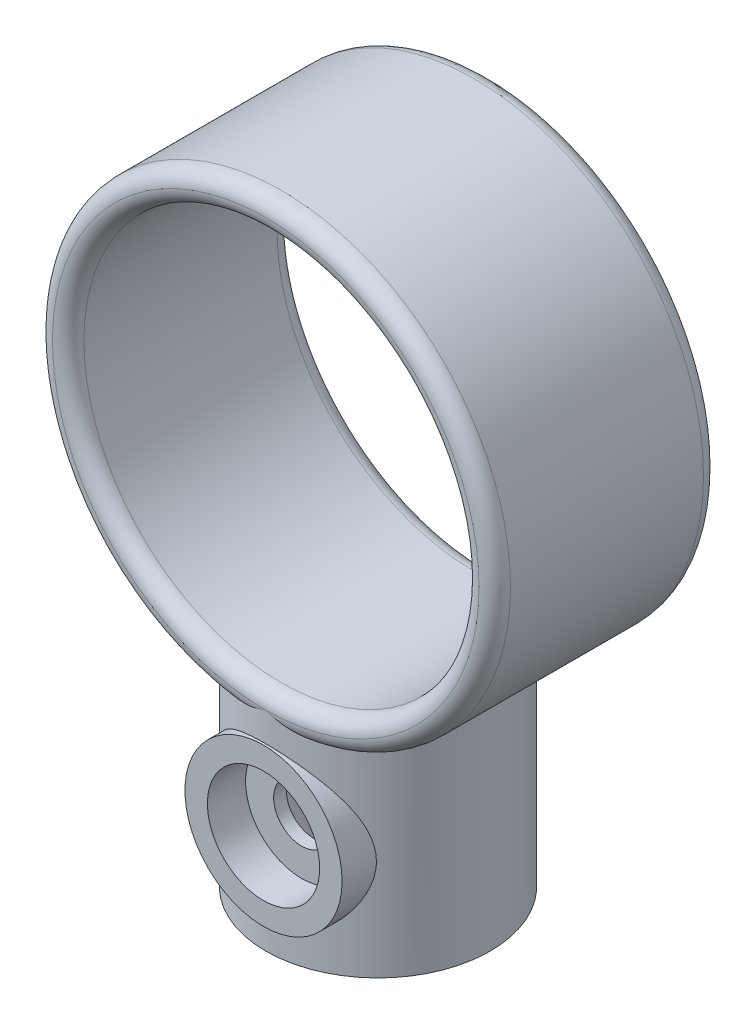
ISO-10303-21;
HEADER;
FILE_DESCRIPTION(('STEP AP214'),'2;1');
FILE_NAME('part.step','',(''),(''),'','','');
FILE_SCHEMA(('AUTOMOTIVE_DESIGN { 1 0 10303 214 1 1 1 1 }'));
ENDSEC;
DATA;
#1=APPLICATION_CONTEXT('core data for automotive mechanical design processes');
#2=APPLICATION_PROTOCOL_DEFINITION('international standard','automotive_design',2000,#1);
#3=PRODUCT_CONTEXT('',#1,'mechanical');
#4=PRODUCT('Part','Part','',(#3));
#5=PRODUCT_RELATED_PRODUCT_CATEGORY('part','',(#4));
#6=PRODUCT_DEFINITION_FORMATION('','',#4);
#7=PRODUCT_DEFINITION_CONTEXT('part definition',#1,'design');
#8=PRODUCT_DEFINITION('design','',#6,#7);
#9=PRODUCT_DEFINITION_SHAPE('','',#8);
#10=(LENGTH_UNIT() NAMED_UNIT(*) SI_UNIT(.MILLI.,.METRE.));
#11=(NAMED_UNIT(*) PLANE_ANGLE_UNIT() SI_UNIT($,.RADIAN.));
#12=(NAMED_UNIT(*) SI_UNIT($,.STERADIAN.) SOLID_ANGLE_UNIT());
#13=UNCERTAINTY_MEASURE_WITH_UNIT(LENGTH_MEASURE(1.E-05),#10,'distance_accuracy_value','');
#14=(GEOMETRIC_REPRESENTATION_CONTEXT(3) GLOBAL_UNCERTAINTY_ASSIGNED_CONTEXT((#13)) GLOBAL_UNIT_ASSIGNED_CONTEXT((#10,
#11,#12)) REPRESENTATION_CONTEXT('',''));
#15=CARTESIAN_POINT('',(0.,0.,0.));
#16=DIRECTION('',(0.,0.,1.));
#17=DIRECTION('',(1.,0.,0.));
#18=AXIS2_PLACEMENT_3D('',#15,#16,#17);
#19=CARTESIAN_POINT('',(-1.5875,-13.081,3.60275071993609));
#20=DIRECTION('',(0.,0.,-1.));
#21=DIRECTION('',(-1.,0.,0.));
#22=AXIS2_PLACEMENT_3D('',#19,#20,#21);
#23=PLANE('',#22);
#24=CARTESIAN_POINT('',(0.,-18.161,3.60275071993609));
#25=DIRECTION('',(0.,0.,-1.));
#26=DIRECTION('',(-1.,0.,0.));
#27=AXIS2_PLACEMENT_3D('',#24,#25,#26);
#28=CIRCLE('',#27,1.5875);
#29=CARTESIAN_POINT('',(1.5875,-18.161,3.60275071993609));
#30=VERTEX_POINT('',#29);
#31=CARTESIAN_POINT('',(-1.5875,-18.161,3.60275071993609));
#32=VERTEX_POINT('',#31);
#33=EDGE_CURVE('E48',#30,#32,#28,.F.);
#34=ORIENTED_EDGE('',*,*,#33,.T.);
#35=DIRECTION('',(0.,-1.,0.));
#36=VECTOR('',#35,1.);
#37=CARTESIAN_POINT('',(-1.5875,-13.081,3.60275071993609));
#38=LINE('',#37,#36);
#39=CARTESIAN_POINT('',(-1.5875,-13.081,3.60275071993609));
#40=VERTEX_POINT('',#39);
#41=EDGE_CURVE('E94',#40,#32,#38,.T.);
#42=ORIENTED_EDGE('',*,*,#41,.F.);
#43=DIRECTION('',(1.,0.,0.));
#44=VECTOR('',#43,1.);
#45=CARTESIAN_POINT('',(-1.5875,-13.081,3.60275071993609));
#46=LINE('',#45,#44);
#47=CARTESIAN_POINT('',(1.5875,-13.081,3.60275071993609));
#48=VERTEX_POINT('',#47);
#49=EDGE_CURVE('E316',#40,#48,#46,.T.);
#50=ORIENTED_EDGE('',*,*,#49,.T.);
#51=DIRECTION('',(0.,-1.,0.));
#52=VECTOR('',#51,1.);
#53=CARTESIAN_POINT('',(1.5875,-13.081,3.60275071993609));
#54=LINE('',#53,#52);
#55=EDGE_CURVE('E97',#48,#30,#54,.T.);
#56=ORIENTED_EDGE('',*,*,#55,.T.);
#57=EDGE_LOOP('',(#34,#42,#50,#56));
#58=FACE_BOUND('',#57,.T.);
#59=ADVANCED_FACE('F32',(#58),#23,.T.);
#60=CARTESIAN_POINT('',(0.,0.,6.35));
#61=DIRECTION('',(0.,0.,-1.));
#62=DIRECTION('',(-1.,0.,0.));
#63=AXIS2_PLACEMENT_3D('',#60,#61,#62);
#64=CYLINDRICAL_SURFACE('',#63,12.954);
#65=CARTESIAN_POINT('',(3.24036710883196,-12.5421743330254,5.461));
#66=CARTESIAN_POINT('',(3.39852522462521,-12.5013289140052,5.3671597632469));
#67=CARTESIAN_POINT('',(3.55217752044027,-12.4584249616043,5.26669390443529));
#68=CARTESIAN_POINT('',(3.84965096987879,-12.3697324218358,5.05333201669568));
#69=CARTESIAN_POINT('',(3.99347466921348,-12.3239445873738,4.94043922640486));
#70=CARTESIAN_POINT('',(4.27083010876806,-12.2306014429006,4.70275872357515));
#71=CARTESIAN_POINT('',(4.40434080334163,-12.1830427976537,4.57794779237893));
#72=CARTESIAN_POINT('',(4.66006458045994,-12.0875364916295,4.31736305313483));
#73=CARTESIAN_POINT('',(4.78227686063104,-12.0395888034862,4.18158846776758));
#74=CARTESIAN_POINT('',(5.01469040120089,-11.944653866851,3.89983668322423));
#75=CARTESIAN_POINT('',(5.12489323990881,-11.8976664928134,3.75386082887165));
#76=CARTESIAN_POINT('',(5.33259764482756,-11.8060325517916,3.45244782369329));
#77=CARTESIAN_POINT('',(5.43009998126519,-11.7613858429551,3.29701124745623));
#78=CARTESIAN_POINT('',(5.61163527866141,-11.6758611465619,2.97754710010607));
#79=CARTESIAN_POINT('',(5.69567354314322,-11.634981677791,2.81352294560311));
#80=CARTESIAN_POINT('',(5.84950609563158,-11.5584072748217,2.47786884938217));
#81=CARTESIAN_POINT('',(5.91930894548802,-11.5227092280187,2.30624355540943));
#82=CARTESIAN_POINT('',(6.04225375411199,-11.4587068535101,1.96119636338971));
#83=CARTESIAN_POINT('',(6.09579731886463,-11.4302277966821,1.78795037114736));
#84=CARTESIAN_POINT('',(6.18802378047826,-11.3805635795997,1.43660218929917));
#85=CARTESIAN_POINT('',(6.22671417876988,-11.3593747380637,1.2585024998054));
#86=CARTESIAN_POINT('',(6.28868651624801,-11.3251840946852,0.89898341229282));
#87=CARTESIAN_POINT('',(6.31197893575739,-11.3121767245828,0.717566358775573));
#88=CARTESIAN_POINT('',(6.3428187521879,-11.2949141873091,0.352992130970151));
#89=CARTESIAN_POINT('',(6.3503680944522,-11.2906579387786,0.169835174488652));
#90=CARTESIAN_POINT('',(6.34965030434776,-11.2910603396301,-0.174261173455878));
#91=CARTESIAN_POINT('',(6.34318530331367,-11.2947032402249,-0.335209077085667));
#92=CARTESIAN_POINT('',(6.31808188918243,-11.3087650134274,-0.655908010113539));
#93=CARTESIAN_POINT('',(6.29943960912104,-11.3191860384627,-0.815658643006467));
#94=CARTESIAN_POINT('',(6.25021818599324,-11.3464388862601,-1.13269687533649));
#95=CARTESIAN_POINT('',(6.21964262857683,-11.3632687832804,-1.28998519988325));
#96=CARTESIAN_POINT('',(6.14689582918937,-11.4027846862798,-1.60116103993987));
#97=CARTESIAN_POINT('',(6.10472002952448,-11.4254729937927,-1.75504719302076));
#98=CARTESIAN_POINT('',(6.00975901220213,-11.475703003346,-2.05669794505564));
#99=CARTESIAN_POINT('',(5.95710152067306,-11.5031858257983,-2.20451262164992));
#100=CARTESIAN_POINT('',(5.84134309078098,-11.5623982498814,-2.49513680883964));
#101=CARTESIAN_POINT('',(5.77823846456497,-11.5941293504009,-2.63794453032428));
#102=CARTESIAN_POINT('',(5.57389486119005,-11.694479243674,-3.05794933233523));
#103=CARTESIAN_POINT('',(5.41761476852702,-11.7682609248339,-3.32676388477283));
#104=CARTESIAN_POINT('',(5.04847190678808,-11.9316543254777,-3.86714840118444));
#105=CARTESIAN_POINT('',(4.83113561669506,-12.0221086764829,-4.1353828885951));
#106=CARTESIAN_POINT('',(4.35599693398777,-12.2022811043992,-4.63311734663731));
#107=CARTESIAN_POINT('',(4.09825242627773,-12.2920000442499,-4.8626717653671));
#108=CARTESIAN_POINT('',(3.72972717262803,-12.405838917192,-5.14055569070788));
#109=CARTESIAN_POINT('',(3.63446711338259,-12.4341060951539,-5.20834633101998));
#110=CARTESIAN_POINT('',(3.44020812182985,-12.4892450919535,-5.33864235829698));
#111=CARTESIAN_POINT('',(3.34121442075257,-12.5161187463556,-5.40115476975097));
#112=CARTESIAN_POINT('',(3.24036710883196,-12.5421743330254,-5.461));
#113=B_SPLINE_CURVE_WITH_KNOTS('',3,(#65,#66,#67,#68,#69,#70,#71,#72,#73,#74,#75,#76,#77,#78,
#79,#80,#81,#82,#83,#84,#85,#86,#87,#88,#89,#90,#91,#92,#93,#94,#95,#96,#97,#98,#99,#100,#101,
#102,#103,#104,#105,#106,#107,#108,#109,#110,#111,#112),.UNSPECIFIED.,.F.,.F.,(4,2,2,2,2,2,2,2,
2,2,2,2,2,2,2,2,2,2,2,2,2,2,2,4),(0.,0.564918574417948,1.12969026993981,1.69558560596926,
2.26152109907353,2.82738212567331,3.39320881942291,3.95881208207186,4.52407415441085,
5.07395790418037,5.623563574629,6.17279478088915,6.72195811563468,7.20471712883733,
7.68762951948826,8.17039691867365,8.65335426707066,9.13075176408271,9.60831814381731,
10.5633377143873,11.6297455977876,12.6946395764977,13.0553653523496,13.4156032331266),.UNSPECIFIED.);
#114=CARTESIAN_POINT('',(3.24036710883196,-12.5421743330254,5.461));
#115=VERTEX_POINT('',#114);
#116=CARTESIAN_POINT('',(3.24036710885588,-12.5421743330192,-5.461));
#117=VERTEX_POINT('',#116);
#118=EDGE_CURVE('E185',#115,#117,#113,.T.);
#119=ORIENTED_EDGE('',*,*,#118,.T.);
#120=CARTESIAN_POINT('',(0.,0.,-5.461));
#121=DIRECTION('',(0.,0.,1.));
#122=DIRECTION('',(1.,0.,0.));
#123=AXIS2_PLACEMENT_3D('',#120,#121,#122);
#124=CIRCLE('',#123,12.954);
#125=CARTESIAN_POINT('',(-3.24036710883196,-12.5421743330254,-5.461));
#126=VERTEX_POINT('',#125);
#127=EDGE_CURVE('E205',#117,#126,#124,.T.);
#128=ORIENTED_EDGE('',*,*,#127,.T.);
#129=CARTESIAN_POINT('',(-3.24036710883196,-12.5421743330254,-5.461));
#130=CARTESIAN_POINT('',(-3.39852522462521,-12.5013289140052,-5.3671597632469));
#131=CARTESIAN_POINT('',(-3.55217752044027,-12.4584249616043,-5.26669390443529));
#132=CARTESIAN_POINT('',(-3.84965096987879,-12.3697324218358,-5.05333201669568));
#133=CARTESIAN_POINT('',(-3.99347466921348,-12.3239445873738,-4.94043922640486));
#134=CARTESIAN_POINT('',(-4.27083010876806,-12.2306014429006,-4.70275872357515));
#135=CARTESIAN_POINT('',(-4.40434080334163,-12.1830427976537,-4.57794779237893));
#136=CARTESIAN_POINT('',(-4.66006458045994,-12.0875364916295,-4.31736305313482));
#137=CARTESIAN_POINT('',(-4.78227686063104,-12.0395888034862,-4.18158846776758));
#138=CARTESIAN_POINT('',(-5.01469040120089,-11.944653866851,-3.89983668322423));
#139=CARTESIAN_POINT('',(-5.12489323990881,-11.8976664928134,-3.75386082887165));
#140=CARTESIAN_POINT('',(-5.33259764482756,-11.8060325517916,-3.45244782369329));
#141=CARTESIAN_POINT('',(-5.43009998126519,-11.7613858429551,-3.29701124745623));
#142=CARTESIAN_POINT('',(-5.61163527866141,-11.6758611465619,-2.97754710010607));
#143=CARTESIAN_POINT('',(-5.69567354314322,-11.634981677791,-2.81352294560311));
#144=CARTESIAN_POINT('',(-5.84950609563158,-11.5584072748217,-2.47786884938217));
#145=CARTESIAN_POINT('',(-5.91930894548802,-11.5227092280187,-2.30624355540943));
#146=CARTESIAN_POINT('',(-6.04225375411199,-11.4587068535101,-1.96119636338971));
#147=CARTESIAN_POINT('',(-6.09579731886463,-11.4302277966821,-1.78795037114737));
#148=CARTESIAN_POINT('',(-6.18802378047826,-11.3805635795997,-1.43660218929917));
#149=CARTESIAN_POINT('',(-6.22671417876988,-11.3593747380637,-1.2585024998054));
#150=CARTESIAN_POINT('',(-6.28868651624801,-11.3251840946852,-0.898983412292822));
#151=CARTESIAN_POINT('',(-6.31197893575739,-11.3121767245828,-0.717566358775575));
#152=CARTESIAN_POINT('',(-6.3428187521879,-11.2949141873091,-0.352992130970153));
#153=CARTESIAN_POINT('',(-6.3503680944522,-11.2906579387786,-0.169835174488654));
#154=CARTESIAN_POINT('',(-6.34965030434776,-11.2910603396301,0.174261173455877));
#155=CARTESIAN_POINT('',(-6.34318530331367,-11.2947032402249,0.335209077085665));
#156=CARTESIAN_POINT('',(-6.31808188918243,-11.3087650134274,0.655908010113539));
#157=CARTESIAN_POINT('',(-6.29943960912104,-11.3191860384627,0.815658643006467));
#158=CARTESIAN_POINT('',(-6.25021818599324,-11.3464388862601,1.13269687533649));
#159=CARTESIAN_POINT('',(-6.21964262857683,-11.3632687832804,1.28998519988325));
#160=CARTESIAN_POINT('',(-6.14689582918937,-11.4027846862798,1.60116103993987));
#161=CARTESIAN_POINT('',(-6.10472002952448,-11.4254729937927,1.75504719302076));
#162=CARTESIAN_POINT('',(-6.00975901220213,-11.475703003346,2.05669794505564));
#163=CARTESIAN_POINT('',(-5.95710152067307,-11.5031858257983,2.20451262164992));
#164=CARTESIAN_POINT('',(-5.84134309078098,-11.5623982498814,2.49513680883964));
#165=CARTESIAN_POINT('',(-5.77823846456497,-11.5941293504009,2.63794453032428));
#166=CARTESIAN_POINT('',(-5.57389486119005,-11.694479243674,3.05794933233523));
#167=CARTESIAN_POINT('',(-5.41761476852702,-11.7682609248339,3.32676388477283));
#168=CARTESIAN_POINT('',(-5.04847190678807,-11.9316543254777,3.86714840118444));
#169=CARTESIAN_POINT('',(-4.83113561669506,-12.0221086764829,4.1353828885951));
#170=CARTESIAN_POINT('',(-4.35599693398777,-12.2022811043992,4.63311734663731));
#171=CARTESIAN_POINT('',(-4.09825242627773,-12.2920000442499,4.8626717653671));
#172=CARTESIAN_POINT('',(-3.72972717262803,-12.405838917192,5.14055569070787));
#173=CARTESIAN_POINT('',(-3.63446711338259,-12.4341060951539,5.20834633101998));
#174=CARTESIAN_POINT('',(-3.44020812182985,-12.4892450919535,5.33864235829698));
#175=CARTESIAN_POINT('',(-3.34121442075257,-12.5161187463556,5.40115476975097));
#176=CARTESIAN_POINT('',(-3.24036710883196,-12.5421743330254,5.461));
#177=B_SPLINE_CURVE_WITH_KNOTS('',3,(#129,#130,#131,#132,#133,#134,#135,#136,#137,#138,#139,
#140,#141,#142,#143,#144,#145,#146,#147,#148,#149,#150,#151,#152,#153,#154,#155,#156,#157,#158,
#159,#160,#161,#162,#163,#164,#165,#166,#167,#168,#169,#170,#171,#172,#173,#174,#175,#176),
.UNSPECIFIED.,.F.,.F.,(4,2,2,2,2,2,2,2,2,2,2,2,2,2,2,2,2,2,2,2,2,2,2,4),(0.,0.564918574417947,
1.12969026993981,1.69558560596926,2.26152109907353,2.8273821256733,3.39320881942291,
3.95881208207186,4.52407415441085,5.07395790418037,5.623563574629,6.17279478088914,
6.72195811563468,7.20471712883733,7.68762951948826,8.17039691867365,8.65335426707066,
9.13075176408271,9.60831814381731,10.5633377143873,11.6297455977876,12.6946395764977,
13.0553653523496,13.4156032331266),.UNSPECIFIED.);
#178=CARTESIAN_POINT('',(-3.24036710885588,-12.5421743330192,5.461));
#179=VERTEX_POINT('',#178);
#180=EDGE_CURVE('E180',#126,#179,#177,.T.);
#181=ORIENTED_EDGE('',*,*,#180,.T.);
#182=CARTESIAN_POINT('',(0.,0.,5.461));
#183=DIRECTION('',(0.,0.,1.));
#184=DIRECTION('',(1.,0.,0.));
#185=AXIS2_PLACEMENT_3D('',#182,#183,#184);
#186=CIRCLE('',#185,12.954);
#187=EDGE_CURVE('E207',#179,#115,#186,.F.);
#188=ORIENTED_EDGE('',*,*,#187,.T.);
#189=EDGE_LOOP('',(#119,#128,#181,#188));
#190=FACE_BOUND('',#189,.T.);
#191=ADVANCED_FACE('F140',(#190),#64,.T.);
#192=CARTESIAN_POINT('',(0.,0.,5.461));
#193=DIRECTION('',(0.,0.,1.));
#194=DIRECTION('',(1.,0.,0.));
#195=AXIS2_PLACEMENT_3D('',#192,#193,#194);
#196=TOROIDAL_SURFACE('',#195,12.065,0.889);
#197=ORIENTED_EDGE('',*,*,#187,.F.);
#198=CARTESIAN_POINT('',(0.,-12.065,6.35));
#199=CARTESIAN_POINT('',(-0.0049753566682711,-12.0668615962767,6.35000001416907));
#200=CARTESIAN_POINT('',(-0.00995194868503857,-12.0687205892014,6.34999416625));
#201=CARTESIAN_POINT('',(-0.296728366632753,-12.1756671678125,6.34931912284531));
#202=CARTESIAN_POINT('',(-0.582434011994521,-12.2723149102974,6.32984568349606));
#203=CARTESIAN_POINT('',(-1.01283058365574,-12.3963076915538,6.27038770900221));
#204=CARTESIAN_POINT('',(-1.15680061958639,-12.4341795165179,6.24547220860568));
#205=CARTESIAN_POINT('',(-1.44453512868541,-12.501251855032,6.18525795196299));
#206=CARTESIAN_POINT('',(-1.58829967387304,-12.5304577027702,6.14996560974658));
#207=CARTESIAN_POINT('',(-1.92510179420407,-12.5867279925364,6.05448732027586));
#208=CARTESIAN_POINT('',(-2.11771865694031,-12.6094410289226,5.98991176140608));
#209=CARTESIAN_POINT('',(-2.40170474368737,-12.6245893779713,5.8791706195158));
#210=CARTESIAN_POINT('',(-2.49539153035808,-12.6264977749512,5.84002066910208));
#211=CARTESIAN_POINT('',(-2.68065923043765,-12.6231756589345,5.75732810358994));
#212=CARTESIAN_POINT('',(-2.77224144974642,-12.6179497015369,5.71378830803747));
#213=CARTESIAN_POINT('',(-2.92708562851502,-12.6020217133466,5.63559423431918));
#214=CARTESIAN_POINT('',(-2.99103977062668,-12.5932835420391,5.60190418118179));
#215=CARTESIAN_POINT('',(-3.1172522850251,-12.5712265256637,5.5326711697423));
#216=CARTESIAN_POINT('',(-3.17950796254431,-12.5579008118376,5.49712550118955));
#217=CARTESIAN_POINT('',(-3.24070414570661,-12.5420872288923,5.4608));
#218=B_SPLINE_CURVE_WITH_KNOTS('',3,(#198,#199,#200,#201,#202,#203,#204,#205,#206,#207,#208,
#209,#210,#211,#212,#213,#214,#215,#216,#217),.UNSPECIFIED.,.F.,.F.,(4,2,2,2,2,2,2,2,2,4),(0.,
0.0159373894726809,0.918168114024223,1.37052248604741,1.82259783900381,2.43338323369564,
2.73776310713718,3.04194871153006,3.26020893139469,3.47879737584277),.UNSPECIFIED.);
#219=CARTESIAN_POINT('',(0.,-12.065,6.35));
#220=VERTEX_POINT('',#219);
#221=EDGE_CURVE('E111',#220,#179,#218,.T.);
#222=ORIENTED_EDGE('',*,*,#221,.F.);
#223=CARTESIAN_POINT('',(0.,0.,6.35));
#224=DIRECTION('',(0.,0.,1.));
#225=DIRECTION('',(1.,0.,0.));
#226=AXIS2_PLACEMENT_3D('',#223,#224,#225);
#227=CIRCLE('',#226,12.065);
#228=EDGE_CURVE('E208',#220,#220,#227,.F.);
#229=ORIENTED_EDGE('',*,*,#228,.T.);
#230=CARTESIAN_POINT('',(3.24070414570661,-12.5420872288923,5.4608));
#231=CARTESIAN_POINT('',(3.1774310042964,-12.5584361228806,5.49835688578515));
#232=CARTESIAN_POINT('',(3.11303726988768,-12.5721249828633,5.53507566968294));
#233=CARTESIAN_POINT('',(2.98241388124331,-12.5946122736088,5.60653441613282));
#234=CARTESIAN_POINT('',(2.91618629688097,-12.6034159995252,5.64127648449298));
#235=CARTESIAN_POINT('',(2.71584054927741,-12.6231183878211,5.74185754330666));
#236=CARTESIAN_POINT('',(2.57940037059394,-12.6274673559493,5.80444370500089));
#237=CARTESIAN_POINT('',(2.32981479595511,-12.6222217751956,5.90838835974526));
#238=CARTESIAN_POINT('',(2.21731158614414,-12.6151794216554,5.95150677758127));
#239=CARTESIAN_POINT('',(1.99072682354883,-12.5930454574676,6.03108112122945));
#240=CARTESIAN_POINT('',(1.876644588231,-12.5779502529667,6.0675340625897));
#241=CARTESIAN_POINT('',(1.53260221143455,-12.5222786501786,6.16689493508247));
#242=CARTESIAN_POINT('',(1.30126722278896,-12.4713340553671,6.21963097731234));
#243=CARTESIAN_POINT('',(0.945543265024305,-12.3775482491074,6.28049610228663));
#244=CARTESIAN_POINT('',(0.8206720099508,-12.3416721954629,6.29799398963606));
#245=CARTESIAN_POINT('',(0.57177283378675,-12.2651057315213,6.32544046759389));
#246=CARTESIAN_POINT('',(0.447743856249001,-12.2244234189153,6.33540155244523));
#247=CARTESIAN_POINT('',(0.220741083864287,-12.1460102464549,6.34700860031076));
#248=CARTESIAN_POINT('',(0.117614624368052,-12.1088706595416,6.3497410597048));
#249=CARTESIAN_POINT('',(0.00995213243816079,-12.068720668117,6.34999415026795));
#250=CARTESIAN_POINT('',(0.00497554271595261,-12.0668616764615,6.34999999803236));
#251=CARTESIAN_POINT('',(0.,-12.065,6.35));
#252=B_SPLINE_CURVE_WITH_KNOTS('',3,(#230,#231,#232,#233,#234,#235,#236,#237,#238,#239,#240,
#241,#242,#243,#244,#245,#246,#247,#248,#249,#250,#251),.UNSPECIFIED.,.F.,.F.,(4,2,2,2,2,2,2,2,
2,2,4),(0.,0.22597447827866,0.451703534699373,0.900832953206218,1.26243424155778,
1.62419704170901,2.34907332049391,2.74214119430658,3.13455601781339,3.46333287329679,
3.4792702627695),.UNSPECIFIED.);
#253=EDGE_CURVE('E110',#115,#220,#252,.T.);
#254=ORIENTED_EDGE('',*,*,#253,.F.);
#255=EDGE_LOOP('',(#197,#222,#229,#254));
#256=FACE_BOUND('',#255,.T.);
#257=ADVANCED_FACE('F143',(#256),#196,.T.);
#258=CARTESIAN_POINT('',(0.,0.,-5.461));
#259=DIRECTION('',(0.,0.,1.));
#260=DIRECTION('',(1.,0.,0.));
#261=AXIS2_PLACEMENT_3D('',#258,#259,#260);
#262=TOROIDAL_SURFACE('',#261,12.065,0.889);
#263=ORIENTED_EDGE('',*,*,#127,.F.);
#264=CARTESIAN_POINT('',(0.,-12.065,-6.35));
#265=CARTESIAN_POINT('',(0.00497535666828668,-12.0668615962766,-6.35000001416907));
#266=CARTESIAN_POINT('',(0.00995194868506923,-12.0687205892013,-6.34999416624999));
#267=CARTESIAN_POINT('',(0.296728366633872,-12.1756671678102,-6.34931912284534));
#268=CARTESIAN_POINT('',(0.582434011995183,-12.2723149102972,-6.32984568349603));
#269=CARTESIAN_POINT('',(1.01283058365648,-12.3963076915543,-6.27038770900208));
#270=CARTESIAN_POINT('',(1.15680061958725,-12.4341795165182,-6.24547220860552));
#271=CARTESIAN_POINT('',(1.44453512868645,-12.5012518550322,-6.18525795196276));
#272=CARTESIAN_POINT('',(1.58829967387415,-12.5304577027704,-6.1499656097463));
#273=CARTESIAN_POINT('',(1.92510179420517,-12.5867279925366,-6.0544873202755));
#274=CARTESIAN_POINT('',(2.11771865694135,-12.6094410289227,-5.98991176140571));
#275=CARTESIAN_POINT('',(2.40170474368834,-12.6245893779713,-5.87917061951541));
#276=CARTESIAN_POINT('',(2.49539153035904,-12.6264977749512,-5.84002066910167));
#277=CARTESIAN_POINT('',(2.6806592304386,-12.6231756589345,-5.7573281035895));
#278=CARTESIAN_POINT('',(2.77224144974736,-12.6179497015368,-5.71378830803702));
#279=CARTESIAN_POINT('',(2.9270856285158,-12.6020217133464,-5.63559423431878));
#280=CARTESIAN_POINT('',(2.9910397706273,-12.5932835420391,-5.60190418118145));
#281=CARTESIAN_POINT('',(3.11725228502542,-12.5712265256637,-5.53267116974212));
#282=CARTESIAN_POINT('',(3.17950796254446,-12.5579008118376,-5.49712550118946));
#283=CARTESIAN_POINT('',(3.24070414570661,-12.5420872288923,-5.4608));
#284=B_SPLINE_CURVE_WITH_KNOTS('',3,(#264,#265,#266,#267,#268,#269,#270,#271,#272,#273,#274,
#275,#276,#277,#278,#279,#280,#281,#282,#283),.UNSPECIFIED.,.F.,.F.,(4,2,2,2,2,2,2,2,2,4),(0.,
0.0159373894726808,0.918168114025008,1.37052248604838,1.82259783900505,2.43338323369668,
2.73776310713822,3.0419487115311,3.26020893139524,3.47879737584277),.UNSPECIFIED.);
#285=CARTESIAN_POINT('',(0.,-12.065,-6.35));
#286=VERTEX_POINT('',#285);
#287=EDGE_CURVE('E195',#286,#117,#284,.T.);
#288=ORIENTED_EDGE('',*,*,#287,.F.);
#289=CARTESIAN_POINT('',(0.,0.,-6.35));
#290=DIRECTION('',(0.,0.,1.));
#291=DIRECTION('',(1.,0.,0.));
#292=AXIS2_PLACEMENT_3D('',#289,#290,#291);
#293=CIRCLE('',#292,12.065);
#294=EDGE_CURVE('E36',#286,#286,#293,.T.);
#295=ORIENTED_EDGE('',*,*,#294,.T.);
#296=CARTESIAN_POINT('',(-3.24070414570661,-12.5420872288923,-5.4608));
#297=CARTESIAN_POINT('',(-3.17741475259311,-12.5584402999693,-5.49836653034597));
#298=CARTESIAN_POINT('',(-3.11300424042003,-12.5721319924933,-5.53509450344806));
#299=CARTESIAN_POINT('',(-2.98234681562706,-12.5946224931739,-5.60657034270185));
#300=CARTESIAN_POINT('',(-2.91610198490131,-12.6034266273882,-5.64132032708143));
#301=CARTESIAN_POINT('',(-2.71577093340349,-12.6231205814618,-5.74188948533188));
#302=CARTESIAN_POINT('',(-2.57936481471077,-12.6274665423752,-5.80445845311833));
#303=CARTESIAN_POINT('',(-2.32985660995942,-12.6222227073724,-5.9083709936535));
#304=CARTESIAN_POINT('',(-2.21739646399143,-12.6151848765296,-5.95147439889096));
#305=CARTESIAN_POINT('',(-1.99089781682094,-12.593064992745,-6.0310236401));
#306=CARTESIAN_POINT('',(-1.87685866320744,-12.5779795118534,-6.0674666301358));
#307=CARTESIAN_POINT('',(-1.53278612909746,-12.5223192113567,-6.16685301443931));
#308=CARTESIAN_POINT('',(-1.30139335136729,-12.4713657030657,-6.21960760504671));
#309=CARTESIAN_POINT('',(-0.89316863555046,-12.3637410327923,-6.28945889008731));
#310=CARTESIAN_POINT('',(-0.716085368217412,-12.31111230312,-6.31197857094203));
#311=CARTESIAN_POINT('',(-0.363866267993672,-12.196927922154,-6.3420209859056));
#312=CARTESIAN_POINT('',(-0.188727245481217,-12.1353903579835,-6.34957366096744));
#313=CARTESIAN_POINT('',(-0.00995206847440345,-12.0687206427481,-6.34999415697097));
#314=CARTESIAN_POINT('',(-0.00497547757902241,-12.0668616505401,-6.35000000488865));
#315=CARTESIAN_POINT('',(0.,-12.065,-6.35));
#316=B_SPLINE_CURVE_WITH_KNOTS('',3,(#296,#297,#298,#299,#300,#301,#302,#303,#304,#305,#306,
#307,#308,#309,#310,#311,#312,#313,#314,#315),.UNSPECIFIED.,.F.,.F.,(4,2,2,2,2,2,2,2,2,4),(0.,
0.226032360071889,0.451817922802393,0.900833123730813,1.26229961684944,1.62392020209434,
2.3490729409033,2.90664789093481,3.46310630194645,3.47904369141914),.UNSPECIFIED.);
#317=EDGE_CURVE('E199',#126,#286,#316,.T.);
#318=ORIENTED_EDGE('',*,*,#317,.F.);
#319=EDGE_LOOP('',(#263,#288,#295,#318));
#320=FACE_BOUND('',#319,.T.);
#321=ADVANCED_FACE('F138',(#320),#262,.T.);
#322=CARTESIAN_POINT('',(0.,0.,6.35));
#323=DIRECTION('',(0.,0.,-1.));
#324=DIRECTION('',(-1.,0.,0.));
#325=AXIS2_PLACEMENT_3D('',#322,#323,#324);
#326=CYLINDRICAL_SURFACE('',#325,11.176);
#327=CARTESIAN_POINT('',(0.,0.,5.461));
#328=DIRECTION('',(0.,0.,1.));
#329=DIRECTION('',(1.,0.,0.));
#330=AXIS2_PLACEMENT_3D('',#327,#328,#329);
#331=CIRCLE('',#330,11.176);
#332=CARTESIAN_POINT('',(11.176,0.,5.461));
#333=VERTEX_POINT('',#332);
#334=EDGE_CURVE('E11',#333,#333,#331,.T.);
#335=ORIENTED_EDGE('',*,*,#334,.T.);
#336=EDGE_LOOP('',(#335));
#337=FACE_BOUND('',#336,.T.);
#338=CARTESIAN_POINT('',(0.,0.,-5.461));
#339=DIRECTION('',(0.,0.,1.));
#340=DIRECTION('',(1.,0.,0.));
#341=AXIS2_PLACEMENT_3D('',#338,#339,#340);
#342=CIRCLE('',#341,11.176);
#343=CARTESIAN_POINT('',(11.176,0.,-5.461));
#344=VERTEX_POINT('',#343);
#345=EDGE_CURVE('E41',#344,#344,#342,.F.);
#346=ORIENTED_EDGE('',*,*,#345,.T.);
#347=EDGE_LOOP('',(#346));
#348=FACE_BOUND('',#347,.T.);
#349=ADVANCED_FACE('F133',(#337,#348),#326,.F.);
#350=CARTESIAN_POINT('',(0.,0.,5.461));
#351=DIRECTION('',(0.,0.,1.));
#352=DIRECTION('',(1.,0.,0.));
#353=AXIS2_PLACEMENT_3D('',#350,#351,#352);
#354=TOROIDAL_SURFACE('',#353,12.065,0.889);
#355=ORIENTED_EDGE('',*,*,#334,.F.);
#356=EDGE_LOOP('',(#355));
#357=FACE_BOUND('',#356,.T.);
#358=ORIENTED_EDGE('',*,*,#228,.F.);
#359=EDGE_LOOP('',(#358));
#360=FACE_BOUND('',#359,.T.);
#361=ADVANCED_FACE('F137',(#357,#360),#354,.T.);
#362=CARTESIAN_POINT('',(0.,0.,-5.461));
#363=DIRECTION('',(0.,0.,1.));
#364=DIRECTION('',(1.,0.,0.));
#365=AXIS2_PLACEMENT_3D('',#362,#363,#364);
#366=TOROIDAL_SURFACE('',#365,12.065,0.889);
#367=ORIENTED_EDGE('',*,*,#345,.F.);
#368=EDGE_LOOP('',(#367));
#369=FACE_BOUND('',#368,.T.);
#370=ORIENTED_EDGE('',*,*,#294,.F.);
#371=EDGE_LOOP('',(#370));
#372=FACE_BOUND('',#371,.T.);
#373=ADVANCED_FACE('F34',(#369,#372),#366,.T.);
#374=CARTESIAN_POINT('',(0.,-23.876,0.));
#375=DIRECTION('',(0.,1.,0.));
#376=DIRECTION('',(0.,0.,1.));
#377=AXIS2_PLACEMENT_3D('',#374,#375,#376);
#378=PLANE('',#377);
#379=DIRECTION('',(1.,0.,0.));
#380=VECTOR('',#379,1.);
#381=CARTESIAN_POINT('',(-1.5875,-23.876,3.60275071993609));
#382=LINE('',#381,#380);
#383=CARTESIAN_POINT('',(-1.5875,-23.876,3.60275071993609));
#384=VERTEX_POINT('',#383);
#385=CARTESIAN_POINT('',(1.5875,-23.876,3.60275071993609));
#386=VERTEX_POINT('',#385);
#387=EDGE_CURVE('E102',#384,#386,#382,.T.);
#388=ORIENTED_EDGE('',*,*,#387,.T.);
#389=CARTESIAN_POINT('',(0.,-23.876,0.));
#390=DIRECTION('',(0.,-1.,0.));
#391=DIRECTION('',(0.,0.,-1.));
#392=AXIS2_PLACEMENT_3D('',#389,#390,#391);
#393=CIRCLE('',#392,3.937);
#394=EDGE_CURVE('E311',#384,#386,#393,.T.);
#395=ORIENTED_EDGE('',*,*,#394,.F.);
#396=EDGE_LOOP('',(#388,#395));
#397=FACE_BOUND('',#396,.T.);
#398=CARTESIAN_POINT('',(0.,-23.876,0.));
#399=DIRECTION('',(0.,1.,0.));
#400=DIRECTION('',(0.,0.,1.));
#401=AXIS2_PLACEMENT_3D('',#398,#399,#400);
#402=CIRCLE('',#401,6.35);
#403=CARTESIAN_POINT('',(0.,-23.876,6.35));
#404=VERTEX_POINT('',#403);
#405=EDGE_CURVE('E190',#404,#404,#402,.T.);
#406=ORIENTED_EDGE('',*,*,#405,.F.);
#407=EDGE_LOOP('',(#406));
#408=FACE_BOUND('',#407,.T.);
#409=ADVANCED_FACE('F172',(#397,#408),#378,.F.);
#410=CARTESIAN_POINT('',(0.,12.955,0.));
#411=DIRECTION('',(0.,-1.,0.));
#412=DIRECTION('',(0.,0.,-1.));
#413=AXIS2_PLACEMENT_3D('',#410,#411,#412);
#414=CYLINDRICAL_SURFACE('',#413,6.35);
#415=CARTESIAN_POINT('',(4.445,-18.161,4.53480705212471));
#416=CARTESIAN_POINT('',(4.44499937226426,-18.0543062104617,4.53480817435838));
#417=CARTESIAN_POINT('',(4.44114970179175,-17.947604609369,4.5385908516571));
#418=CARTESIAN_POINT('',(4.42584625658274,-17.7352688962428,4.55351466320305));
#419=CARTESIAN_POINT('',(4.41439151580632,-17.6296349215562,4.56465673228177));
#420=CARTESIAN_POINT('',(4.38411489349384,-17.4202074648285,4.59374296170095));
#421=CARTESIAN_POINT('',(4.36528078663444,-17.3164173372938,4.61169840813297));
#422=CARTESIAN_POINT('',(4.32061506402358,-17.111562259133,4.6535707880969));
#423=CARTESIAN_POINT('',(4.29477965186273,-17.0104988198222,4.67749095539396));
#424=CARTESIAN_POINT('',(4.20805864146235,-16.7145755316713,4.75612989156855));
#425=CARTESIAN_POINT('',(4.1375658697096,-16.5243845552112,4.81813098430965));
#426=CARTESIAN_POINT('',(3.97374457036276,-16.1591071017085,4.95410739509535));
#427=CARTESIAN_POINT('',(3.88041445241552,-15.9840216777394,5.0280835469408));
#428=CARTESIAN_POINT('',(3.65450412637949,-15.6201107312722,5.19519851741961));
#429=CARTESIAN_POINT('',(3.51791257863916,-15.4342485345078,5.28942445404757));
#430=CARTESIAN_POINT('',(3.29274248815772,-15.1728362656057,5.43030880197128));
#431=CARTESIAN_POINT('',(3.21422605992021,-15.0885281254412,5.47723622902179));
#432=CARTESIAN_POINT('',(3.05053180145258,-14.9259439168237,5.57006248753736));
#433=CARTESIAN_POINT('',(2.96535249320912,-14.847669194441,5.61596108785811));
#434=CARTESIAN_POINT('',(2.77375715261863,-14.6849938680636,5.71333259865051));
#435=CARTESIAN_POINT('',(2.66617104933573,-14.6017557304317,5.76445514172369));
#436=CARTESIAN_POINT('',(2.44262247319303,-14.4447835453916,5.86267815700416));
#437=CARTESIAN_POINT('',(2.32666380732259,-14.3710452203755,5.90978043622213));
#438=CARTESIAN_POINT('',(2.08698830160187,-14.2339751159398,5.99860631962558));
#439=CARTESIAN_POINT('',(1.96328183206009,-14.1706298202214,6.04033689432561));
#440=CARTESIAN_POINT('',(1.70883584769476,-14.05521975299,6.11719376483098));
#441=CARTESIAN_POINT('',(1.57809942629398,-14.0031500697101,6.15232293538721));
#442=CARTESIAN_POINT('',(1.24886776209414,-13.8900579018676,6.22920254107761));
#443=CARTESIAN_POINT('',(1.04687520671796,-13.8359409455553,6.26656155153516));
#444=CARTESIAN_POINT('',(0.634826066962817,-13.756569902183,6.32160276512936));
#445=CARTESIAN_POINT('',(0.424776060168703,-13.731292769459,6.33930067898737));
#446=CARTESIAN_POINT('',(0.00205416525750942,-13.7109597100946,6.35352469634726));
#447=CARTESIAN_POINT('',(-0.210622016969536,-13.7159624776007,6.35000968103446));
#448=CARTESIAN_POINT('',(-0.631721117224518,-13.7560342419567,6.32202480712433));
#449=CARTESIAN_POINT('',(-0.840142832593178,-13.7911116230694,6.29754910506577));
#450=CARTESIAN_POINT('',(-1.24229246725656,-13.8882276719979,6.23055861091826));
#451=CARTESIAN_POINT('',(-1.43624715662474,-13.9496328510411,6.18846819355933));
#452=CARTESIAN_POINT('',(-1.81067974760511,-14.0965248535983,6.08945775912985));
#453=CARTESIAN_POINT('',(-1.99115499287911,-14.1820164079566,6.03253482894641));
#454=CARTESIAN_POINT('',(-2.35550833899621,-14.3850424967605,5.90048404358387));
#455=CARTESIAN_POINT('',(-2.53749482523016,-14.5050965133554,5.82402997861831));
#456=CARTESIAN_POINT('',(-2.87985061084704,-14.7681824230859,5.66258695718167));
#457=CARTESIAN_POINT('',(-3.04019628262501,-14.9112390632812,5.57758884605276));
#458=CARTESIAN_POINT('',(-3.3646833485993,-15.2454486036576,5.38910708932857));
#459=CARTESIAN_POINT('',(-3.52438847400279,-15.4406283097972,5.28503307926767));
#460=CARTESIAN_POINT('',(-3.73833974196012,-15.7529392794752,5.13371333179926));
#461=CARTESIAN_POINT('',(-3.80540844681253,-15.860341643258,5.08405510127247));
#462=CARTESIAN_POINT('',(-3.9306445853808,-16.0815232585949,4.98786048075575));
#463=CARTESIAN_POINT('',(-3.98881360622027,-16.1953013681752,4.94132353496535));
#464=CARTESIAN_POINT('',(-4.12441481410371,-16.4918230257632,4.82939292730599));
#465=CARTESIAN_POINT('',(-4.195479425512,-16.6788675302507,4.76724819560771));
#466=CARTESIAN_POINT('',(-4.28328877069037,-16.968667225053,4.68801648167419));
#467=CARTESIAN_POINT('',(-4.309421406791,-17.0667698716562,4.66394281024833));
#468=CARTESIAN_POINT('',(-4.35508801632044,-17.2656632230244,4.62132920856958));
#469=CARTESIAN_POINT('',(-4.37462524302999,-17.3664525759825,4.60278655059156));
#470=CARTESIAN_POINT('',(-4.40692541435345,-17.5711814174505,4.57187247315353));
#471=CARTESIAN_POINT('',(-4.41961400301748,-17.6751430222702,4.55956887495373));
#472=CARTESIAN_POINT('',(-4.43762088504229,-17.8843019712298,4.542045825116));
#473=CARTESIAN_POINT('',(-4.44293944365018,-17.9894992707597,4.5368261185292));
#474=CARTESIAN_POINT('',(-4.44607439727054,-18.200088719659,4.53375450976119));
#475=CARTESIAN_POINT('',(-4.44389302999035,-18.3054808015341,4.53590040994828));
#476=CARTESIAN_POINT('',(-4.43209711507275,-18.5154169267058,4.54742491527383));
#477=CARTESIAN_POINT('',(-4.42248288122301,-18.6199610056135,4.55680321508753));
#478=CARTESIAN_POINT('',(-4.38647618562038,-18.9020129599812,4.59155489348536));
#479=CARTESIAN_POINT('',(-4.35298747831399,-19.0778606972519,4.62358296747564));
#480=CARTESIAN_POINT('',(-4.26642994230559,-19.4207751557765,4.70356253506293));
#481=CARTESIAN_POINT('',(-4.21334047070603,-19.5878324064785,4.75153081102869));
#482=CARTESIAN_POINT('',(-4.06024843221093,-19.9878539898723,4.88377603614723));
#483=CARTESIAN_POINT('',(-3.94992745732291,-20.2147933782112,4.97451235728908));
#484=CARTESIAN_POINT('',(-3.75917535437004,-20.5363386685177,5.1183519020576));
#485=CARTESIAN_POINT('',(-3.69126733913885,-20.6405082590847,5.16766164218047));
#486=CARTESIAN_POINT('',(-3.54730037094088,-20.8424255237134,5.26752582665756));
#487=CARTESIAN_POINT('',(-3.47124236136062,-20.9401739389373,5.31808012642954));
#488=CARTESIAN_POINT('',(-3.22822410221054,-21.2269740998875,5.47157669756017));
#489=CARTESIAN_POINT('',(-3.04874163938711,-21.4056701748334,5.57451767422398));
#490=CARTESIAN_POINT('',(-2.65915223171059,-21.7319037414684,5.7705229833228));
#491=CARTESIAN_POINT('',(-2.44909096847762,-21.8794869212965,5.8636016967252));
#492=CARTESIAN_POINT('',(-2.03697587503018,-22.1177390294133,6.01775884812271));
#493=CARTESIAN_POINT('',(-1.83908252042203,-22.213746383721,6.08157679555183));
#494=CARTESIAN_POINT('',(-1.53014216100333,-22.3358047138788,6.16381241836301));
#495=CARTESIAN_POINT('',(-1.42511517042238,-22.3728391096236,6.18898074106654));
#496=CARTESIAN_POINT('',(-1.21160233712545,-22.43914444756,6.23429261202296));
#497=CARTESIAN_POINT('',(-1.10311801147656,-22.4684187437141,6.25443833085132));
#498=CARTESIAN_POINT('',(-0.882708606186505,-22.5189487142884,6.28934471809113));
#499=CARTESIAN_POINT('',(-0.770766178891977,-22.5401528038878,6.30407072456167));
#500=CARTESIAN_POINT('',(-0.545015755388297,-22.5739355661531,6.32758466604958));
#501=CARTESIAN_POINT('',(-0.431208619216148,-22.5865181066072,6.33637526377652));
#502=CARTESIAN_POINT('',(-0.202662090398155,-22.6028551192495,6.34779628702463));
#503=CARTESIAN_POINT('',(-0.0879227755885307,-22.6066103210641,6.35042722167452));
#504=CARTESIAN_POINT('',(0.141469078953985,-22.6052284172628,6.34945989567658));
#505=CARTESIAN_POINT('',(0.256121624558314,-22.6000919796632,6.3458621029842));
#506=CARTESIAN_POINT('',(0.473258392634381,-22.5819434751494,6.33318075434035));
#507=CARTESIAN_POINT('',(0.57584457619541,-22.5697433210005,6.3246629237035));
#508=CARTESIAN_POINT('',(0.779430912865083,-22.5383438831856,6.30281617397871));
#509=CARTESIAN_POINT('',(0.880430552217447,-22.5191423791598,6.28948572866459));
#510=CARTESIAN_POINT('',(1.18000332653638,-22.4513882080845,6.24266016011324));
#511=CARTESIAN_POINT('',(1.37532485761209,-22.3926707818378,6.20231996608768));
#512=CARTESIAN_POINT('',(1.75931162717061,-22.2483562681035,6.10475557397192));
#513=CARTESIAN_POINT('',(1.94750439354324,-22.1618900603894,6.04698969135255));
#514=CARTESIAN_POINT('',(2.30692333360343,-21.9660016069378,5.91920622575193));
#515=CARTESIAN_POINT('',(2.47814621587919,-21.8565749206556,5.84918627327519));
#516=CARTESIAN_POINT('',(2.82728501030964,-21.598832646857,5.68958211267469));
#517=CARTESIAN_POINT('',(3.00206037649463,-21.4471116105298,5.59865076334375));
#518=CARTESIAN_POINT('',(3.32551437484808,-21.119397825323,5.41278864115981));
#519=CARTESIAN_POINT('',(3.47413723857483,-20.9433546035873,5.31784984430135));
#520=CARTESIAN_POINT('',(3.68654238045336,-20.6480089828363,5.17116088376289));
#521=CARTESIAN_POINT('',(3.75970536628681,-20.5360096793639,5.11805089648958));
#522=CARTESIAN_POINT('',(3.89621323367549,-20.3047302324748,5.01491068402902));
#523=CARTESIAN_POINT('',(3.95955534709653,-20.1854480494455,4.96488132954294));
#524=CARTESIAN_POINT('',(4.0756128160575,-19.9402570793031,4.87006008376553));
#525=CARTESIAN_POINT('',(4.12835637296903,-19.8143670330098,4.82525443009759));
#526=CARTESIAN_POINT('',(4.22262742395083,-19.5561030153956,4.74297788425414));
#527=CARTESIAN_POINT('',(4.26415773672454,-19.4237306834466,4.70550514943613));
#528=CARTESIAN_POINT('',(4.32331466723001,-19.1981705889984,4.65107391965118));
#529=CARTESIAN_POINT('',(4.34430437034882,-19.1065011677689,4.63142948691346));
#530=CARTESIAN_POINT('',(4.38054261843183,-18.9211204276596,4.597169812373));
#531=CARTESIAN_POINT('',(4.39579299447872,-18.8274097701297,4.58255296669033));
#532=CARTESIAN_POINT('',(4.42028819027883,-18.638623691872,4.55893009344278));
#533=CARTESIAN_POINT('',(4.42954074901578,-18.5435501922634,4.54991683618506));
#534=CARTESIAN_POINT('',(4.4418960346315,-18.3526530769421,4.53785568566579));
#535=CARTESIAN_POINT('',(4.44500056381651,-18.2568296893328,4.53480604416253));
#536=CARTESIAN_POINT('',(4.445,-18.161,4.53480705212471));
#537=B_SPLINE_CURVE_WITH_KNOTS('',3,(#415,#416,#417,#418,#419,#420,#421,#422,#423,#424,#425,
#426,#427,#428,#429,#430,#431,#432,#433,#434,#435,#436,#437,#438,#439,#440,#441,#442,#443,#444,
#445,#446,#447,#448,#449,#450,#451,#452,#453,#454,#455,#456,#457,#458,#459,#460,#461,#462,#463,
#464,#465,#466,#467,#468,#469,#470,#471,#472,#473,#474,#475,#476,#477,#478,#479,#480,#481,#482,
#483,#484,#485,#486,#487,#488,#489,#490,#491,#492,#493,#494,#495,#496,#497,#498,#499,#500,#501,
#502,#503,#504,#505,#506,#507,#508,#509,#510,#511,#512,#513,#514,#515,#516,#517,#518,#519,#520,
#521,#522,#523,#524,#525,#526,#527,#528,#529,#530,#531,#532,#533,#534,#535,#536),.UNSPECIFIED.,
.T.,.F.,(4,2,2,2,2,2,2,2,2,2,2,2,2,2,2,2,2,2,2,2,2,2,2,2,2,2,2,2,2,2,2,2,2,2,2,2,2,2,2,2,2,2,2,
2,2,2,2,2,2,2,2,2,2,2,2,2,2,2,2,2,4),(0.,0.319961090343784,0.639962831769823,0.9604969739257,
1.28120527248742,1.91474985974657,2.54833857851342,3.29288327875049,3.66582285231053,
4.03884539020629,4.47420897352057,4.90937582952367,5.34397217952196,5.7783788325698,
6.41267801905818,7.04646998654551,7.6814908806916,8.3166888648554,8.93739239649857,
9.55821792662888,10.2487241931761,10.939978364017,11.7546838728289,12.1623275780287,
12.5698985012087,13.1957467427592,13.5084512847206,13.8210013545063,14.1368798167071,
14.4527469101585,14.7685197684424,15.0842792967118,15.6273792592386,16.1710528364838,
16.9708384657586,17.3718491847736,17.7728135356235,18.5892956576327,19.4045703230328,
20.0885218790786,20.4306834414943,20.7726968775734,21.1168611491107,21.4608709208491,
21.8048522573574,22.1488077521575,22.459413211449,22.7701172598101,23.3910051958211,
24.0336313249731,24.6763818524316,25.4196456663554,26.164475723186,26.5958226731905,
27.027290983496,27.4575955506047,27.887791849976,28.1757212497948,28.463558710195,
28.7510240307355,29.0384050678033),.UNSPECIFIED.);
#538=CARTESIAN_POINT('',(4.445,-18.161,4.53480705212471));
#539=VERTEX_POINT('',#538);
#540=EDGE_CURVE('E305',#539,#539,#537,.T.);
#541=ORIENTED_EDGE('',*,*,#540,.F.);
#542=EDGE_LOOP('',(#541));
#543=FACE_BOUND('',#542,.T.);
#544=ORIENTED_EDGE('',*,*,#118,.F.);
#545=ORIENTED_EDGE('',*,*,#253,.T.);
#546=ORIENTED_EDGE('',*,*,#221,.T.);
#547=ORIENTED_EDGE('',*,*,#180,.F.);
#548=ORIENTED_EDGE('',*,*,#317,.T.);
#549=ORIENTED_EDGE('',*,*,#287,.T.);
#550=EDGE_LOOP('',(#544,#545,#546,#547,#548,#549));
#551=FACE_BOUND('',#550,.T.);
#552=ORIENTED_EDGE('',*,*,#405,.T.);
#553=EDGE_LOOP('',(#552));
#554=FACE_BOUND('',#553,.T.);
#555=ADVANCED_FACE('F126',(#543,#551,#554),#414,.T.);
#556=CARTESIAN_POINT('',(0.,-13.081,0.));
#557=DIRECTION('',(0.,-1.,0.));
#558=DIRECTION('',(0.,0.,-1.));
#559=AXIS2_PLACEMENT_3D('',#556,#557,#558);
#560=CYLINDRICAL_SURFACE('',#559,3.937);
#561=ORIENTED_EDGE('',*,*,#394,.T.);
#562=EDGE_CURVE('E55',#30,#386,#54,.T.);
#563=ORIENTED_EDGE('',*,*,#562,.F.);
#564=ORIENTED_EDGE('',*,*,#55,.F.);
#565=CARTESIAN_POINT('',(0.,-13.081,0.));
#566=DIRECTION('',(0.,-1.,0.));
#567=DIRECTION('',(0.,0.,-1.));
#568=AXIS2_PLACEMENT_3D('',#565,#566,#567);
#569=CIRCLE('',#568,3.937);
#570=EDGE_CURVE('E109',#40,#48,#569,.T.);
#571=ORIENTED_EDGE('',*,*,#570,.F.);
#572=ORIENTED_EDGE('',*,*,#41,.T.);
#573=EDGE_CURVE('E99',#32,#384,#38,.T.);
#574=ORIENTED_EDGE('',*,*,#573,.T.);
#575=EDGE_LOOP('',(#561,#563,#564,#571,#572,#574));
#576=FACE_BOUND('',#575,.T.);
#577=ADVANCED_FACE('F107',(#576),#560,.F.);
#578=EDGE_CURVE('E85',#32,#30,#28,.F.);
#579=ORIENTED_EDGE('',*,*,#578,.T.);
#580=ORIENTED_EDGE('',*,*,#562,.T.);
#581=ORIENTED_EDGE('',*,*,#387,.F.);
#582=ORIENTED_EDGE('',*,*,#573,.F.);
#583=EDGE_LOOP('',(#579,#580,#581,#582));
#584=FACE_BOUND('',#583,.T.);
#585=ADVANCED_FACE('F100',(#584),#23,.T.);
#586=CARTESIAN_POINT('',(0.,-13.081,0.));
#587=DIRECTION('',(0.,-1.,0.));
#588=DIRECTION('',(0.,0.,-1.));
#589=AXIS2_PLACEMENT_3D('',#586,#587,#588);
#590=PLANE('',#589);
#591=ORIENTED_EDGE('',*,*,#570,.T.);
#592=ORIENTED_EDGE('',*,*,#49,.F.);
#593=EDGE_LOOP('',(#591,#592));
#594=FACE_BOUND('',#593,.T.);
#595=ADVANCED_FACE('F162',(#594),#590,.T.);
#596=CARTESIAN_POINT('',(0.,-18.161,6.477));
#597=DIRECTION('',(0.,0.,1.));
#598=DIRECTION('',(1.,0.,0.));
#599=AXIS2_PLACEMENT_3D('',#596,#597,#598);
#600=PLANE('',#599);
#601=CARTESIAN_POINT('',(0.,-18.161,6.477));
#602=DIRECTION('',(0.,0.,1.));
#603=DIRECTION('',(1.,0.,0.));
#604=AXIS2_PLACEMENT_3D('',#601,#602,#603);
#605=CIRCLE('',#604,3.175);
#606=CARTESIAN_POINT('',(3.175,-18.161,6.477));
#607=VERTEX_POINT('',#606);
#608=EDGE_CURVE('E89',#607,#607,#605,.T.);
#609=ORIENTED_EDGE('',*,*,#608,.F.);
#610=EDGE_LOOP('',(#609));
#611=FACE_BOUND('',#610,.T.);
#612=CARTESIAN_POINT('',(0.,-18.161,6.477));
#613=DIRECTION('',(0.,0.,1.));
#614=DIRECTION('',(1.,0.,0.));
#615=AXIS2_PLACEMENT_3D('',#612,#613,#614);
#616=CIRCLE('',#615,4.445);
#617=CARTESIAN_POINT('',(4.445,-18.161,6.477));
#618=VERTEX_POINT('',#617);
#619=EDGE_CURVE('E312',#618,#618,#616,.T.);
#620=ORIENTED_EDGE('',*,*,#619,.T.);
#621=EDGE_LOOP('',(#620));
#622=FACE_BOUND('',#621,.T.);
#623=ADVANCED_FACE('F167',(#611,#622),#600,.T.);
#624=CARTESIAN_POINT('',(0.,-18.161,-6.351));
#625=DIRECTION('',(0.,0.,1.));
#626=DIRECTION('',(1.,0.,0.));
#627=AXIS2_PLACEMENT_3D('',#624,#625,#626);
#628=CYLINDRICAL_SURFACE('',#627,4.445);
#629=ORIENTED_EDGE('',*,*,#619,.F.);
#630=EDGE_LOOP('',(#629));
#631=FACE_BOUND('',#630,.T.);
#632=ORIENTED_EDGE('',*,*,#540,.T.);
#633=EDGE_LOOP('',(#632));
#634=FACE_BOUND('',#633,.T.);
#635=ADVANCED_FACE('F245',(#631,#634),#628,.T.);
#636=CARTESIAN_POINT('',(0.,-18.161,4.318));
#637=DIRECTION('',(0.,0.,1.));
#638=DIRECTION('',(1.,0.,0.));
#639=AXIS2_PLACEMENT_3D('',#636,#637,#638);
#640=CYLINDRICAL_SURFACE('',#639,3.175);
#641=CARTESIAN_POINT('',(0.,-18.161,4.318));
#642=DIRECTION('',(0.,0.,1.));
#643=DIRECTION('',(1.,0.,0.));
#644=AXIS2_PLACEMENT_3D('',#641,#642,#643);
#645=CIRCLE('',#644,3.175);
#646=CARTESIAN_POINT('',(3.175,-18.161,4.318));
#647=VERTEX_POINT('',#646);
#648=EDGE_CURVE('E319',#647,#647,#645,.T.);
#649=ORIENTED_EDGE('',*,*,#648,.F.);
#650=EDGE_LOOP('',(#649));
#651=FACE_BOUND('',#650,.T.);
#652=ORIENTED_EDGE('',*,*,#608,.T.);
#653=EDGE_LOOP('',(#652));
#654=FACE_BOUND('',#653,.T.);
#655=ADVANCED_FACE('F250',(#651,#654),#640,.F.);
#656=CARTESIAN_POINT('',(0.,-18.161,4.318));
#657=DIRECTION('',(0.,0.,1.));
#658=DIRECTION('',(1.,0.,0.));
#659=AXIS2_PLACEMENT_3D('',#656,#657,#658);
#660=PLANE('',#659);
#661=CARTESIAN_POINT('',(0.,-18.161,4.318));
#662=DIRECTION('',(0.,0.,1.));
#663=DIRECTION('',(1.,0.,0.));
#664=AXIS2_PLACEMENT_3D('',#661,#662,#663);
#665=CIRCLE('',#664,1.5875);
#666=CARTESIAN_POINT('',(1.5875,-18.161,4.318));
#667=VERTEX_POINT('',#666);
#668=EDGE_CURVE('E98',#667,#667,#665,.T.);
#669=ORIENTED_EDGE('',*,*,#668,.F.);
#670=EDGE_LOOP('',(#669));
#671=FACE_BOUND('',#670,.T.);
#672=ORIENTED_EDGE('',*,*,#648,.T.);
#673=EDGE_LOOP('',(#672));
#674=FACE_BOUND('',#673,.T.);
#675=ADVANCED_FACE('F268',(#671,#674),#660,.T.);
#676=CARTESIAN_POINT('',(0.,-18.161,-6.351));
#677=DIRECTION('',(0.,0.,1.));
#678=DIRECTION('',(1.,0.,0.));
#679=AXIS2_PLACEMENT_3D('',#676,#677,#678);
#680=CYLINDRICAL_SURFACE('',#679,1.5875);
#681=ORIENTED_EDGE('',*,*,#578,.F.);
#682=ORIENTED_EDGE('',*,*,#33,.F.);
#683=EDGE_LOOP('',(#681,#682));
#684=FACE_BOUND('',#683,.T.);
#685=ORIENTED_EDGE('',*,*,#668,.T.);
#686=EDGE_LOOP('',(#685));
#687=FACE_BOUND('',#686,.T.);
#688=ADVANCED_FACE('F86',(#684,#687),#680,.F.);
#689=CLOSED_SHELL('',(#59,#191,#257,#321,#349,#361,#373,#409,#555,#577,#585,#595,#623,#635,#655,
#675,#688));
#690=MANIFOLD_SOLID_BREP('B2',#689);
#691=ADVANCED_BREP_SHAPE_REPRESENTATION('',(#18,#690),#14);
#692=SHAPE_DEFINITION_REPRESENTATION(#9,#691);
ENDSEC;
END-ISO-10303-21;
